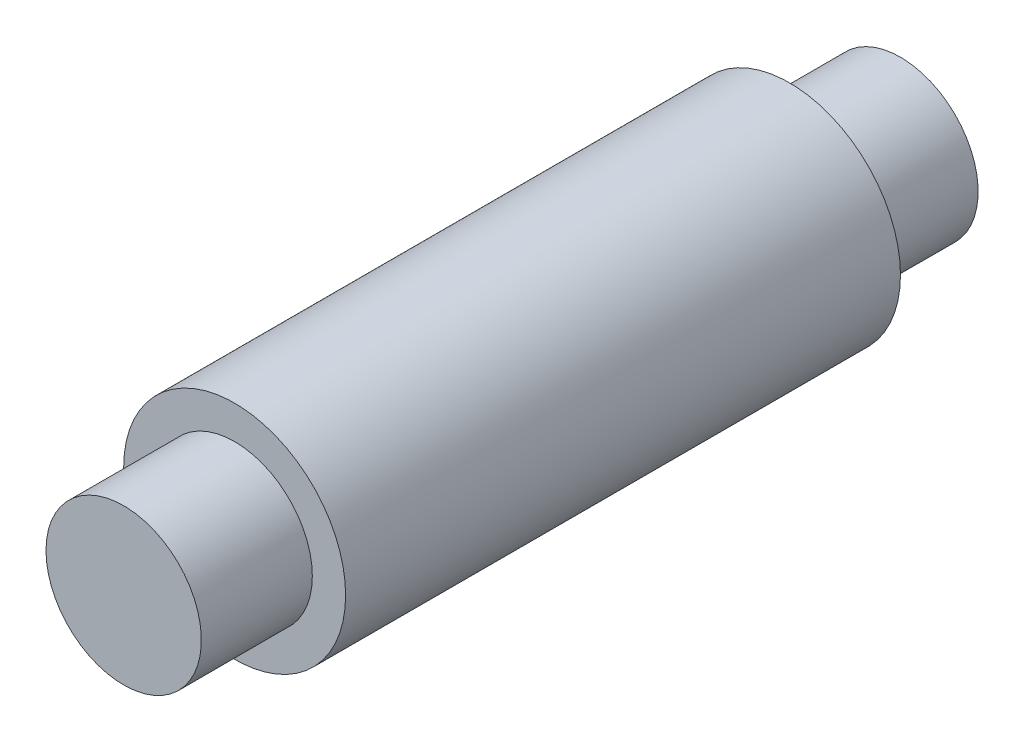
ISO-10303-21;
HEADER;
FILE_DESCRIPTION(('STEP AP214'),'2;1');
FILE_NAME('part.step','',(''),(''),'','','');
FILE_SCHEMA(('AUTOMOTIVE_DESIGN { 1 0 10303 214 1 1 1 1 }'));
ENDSEC;
DATA;
#1=APPLICATION_CONTEXT('core data for automotive mechanical design processes');
#2=APPLICATION_PROTOCOL_DEFINITION('international standard','automotive_design',2000,#1);
#3=PRODUCT_CONTEXT('',#1,'mechanical');
#4=PRODUCT('Part','Part','',(#3));
#5=PRODUCT_RELATED_PRODUCT_CATEGORY('part','',(#4));
#6=PRODUCT_DEFINITION_FORMATION('','',#4);
#7=PRODUCT_DEFINITION_CONTEXT('part definition',#1,'design');
#8=PRODUCT_DEFINITION('design','',#6,#7);
#9=PRODUCT_DEFINITION_SHAPE('','',#8);
#10=(LENGTH_UNIT() NAMED_UNIT(*) SI_UNIT(.MILLI.,.METRE.));
#11=(NAMED_UNIT(*) PLANE_ANGLE_UNIT() SI_UNIT($,.RADIAN.));
#12=(NAMED_UNIT(*) SI_UNIT($,.STERADIAN.) SOLID_ANGLE_UNIT());
#13=UNCERTAINTY_MEASURE_WITH_UNIT(LENGTH_MEASURE(1.E-05),#10,'distance_accuracy_value','');
#14=(GEOMETRIC_REPRESENTATION_CONTEXT(3) GLOBAL_UNCERTAINTY_ASSIGNED_CONTEXT((#13)) GLOBAL_UNIT_ASSIGNED_CONTEXT((#10,
#11,#12)) REPRESENTATION_CONTEXT('',''));
#15=CARTESIAN_POINT('',(0.,0.,0.));
#16=DIRECTION('',(0.,0.,1.));
#17=DIRECTION('',(1.,0.,0.));
#18=AXIS2_PLACEMENT_3D('',#15,#16,#17);
#19=CARTESIAN_POINT('',(0.,0.,10.));
#20=DIRECTION('',(0.,0.,1.));
#21=DIRECTION('',(1.,0.,0.));
#22=AXIS2_PLACEMENT_3D('',#19,#20,#21);
#23=PLANE('',#22);
#24=CARTESIAN_POINT('',(0.,0.,10.));
#25=DIRECTION('',(0.,0.,1.));
#26=DIRECTION('',(1.,0.,0.));
#27=AXIS2_PLACEMENT_3D('',#24,#25,#26);
#28=CIRCLE('',#27,1.4);
#29=CARTESIAN_POINT('',(1.4,0.,10.));
#30=VERTEX_POINT('',#29);
#31=EDGE_CURVE('E10',#30,#30,#28,.T.);
#32=ORIENTED_EDGE('',*,*,#31,.F.);
#33=EDGE_LOOP('',(#32));
#34=FACE_BOUND('',#33,.T.);
#35=CARTESIAN_POINT('',(0.,0.,10.));
#36=DIRECTION('',(0.,0.,1.));
#37=DIRECTION('',(1.,0.,0.));
#38=AXIS2_PLACEMENT_3D('',#35,#36,#37);
#39=CIRCLE('',#38,2.);
#40=CARTESIAN_POINT('',(2.,0.,10.));
#41=VERTEX_POINT('',#40);
#42=EDGE_CURVE('E54',#41,#41,#39,.T.);
#43=ORIENTED_EDGE('',*,*,#42,.T.);
#44=EDGE_LOOP('',(#43));
#45=FACE_BOUND('',#44,.T.);
#46=ADVANCED_FACE('F45',(#34,#45),#23,.T.);
#47=CARTESIAN_POINT('',(0.,0.,0.));
#48=DIRECTION('',(0.,0.,1.));
#49=DIRECTION('',(1.,0.,0.));
#50=AXIS2_PLACEMENT_3D('',#47,#48,#49);
#51=PLANE('',#50);
#52=CARTESIAN_POINT('',(0.,0.,0.));
#53=DIRECTION('',(0.,0.,1.));
#54=DIRECTION('',(1.,0.,0.));
#55=AXIS2_PLACEMENT_3D('',#52,#53,#54);
#56=CIRCLE('',#55,1.4);
#57=CARTESIAN_POINT('',(1.4,0.,0.));
#58=VERTEX_POINT('',#57);
#59=EDGE_CURVE('E49',#58,#58,#56,.T.);
#60=ORIENTED_EDGE('',*,*,#59,.T.);
#61=EDGE_LOOP('',(#60));
#62=FACE_BOUND('',#61,.T.);
#63=CARTESIAN_POINT('',(0.,0.,0.));
#64=DIRECTION('',(0.,0.,1.));
#65=DIRECTION('',(1.,0.,0.));
#66=AXIS2_PLACEMENT_3D('',#63,#64,#65);
#67=CIRCLE('',#66,2.);
#68=CARTESIAN_POINT('',(2.,0.,0.));
#69=VERTEX_POINT('',#68);
#70=EDGE_CURVE('E60',#69,#69,#67,.T.);
#71=ORIENTED_EDGE('',*,*,#70,.F.);
#72=EDGE_LOOP('',(#71));
#73=FACE_BOUND('',#72,.T.);
#74=ADVANCED_FACE('F98',(#62,#73),#51,.F.);
#75=CARTESIAN_POINT('',(0.,0.,10.));
#76=DIRECTION('',(0.,0.,-1.));
#77=DIRECTION('',(-1.,0.,0.));
#78=AXIS2_PLACEMENT_3D('',#75,#76,#77);
#79=CYLINDRICAL_SURFACE('',#78,2.);
#80=ORIENTED_EDGE('',*,*,#42,.F.);
#81=EDGE_LOOP('',(#80));
#82=FACE_BOUND('',#81,.T.);
#83=ORIENTED_EDGE('',*,*,#70,.T.);
#84=EDGE_LOOP('',(#83));
#85=FACE_BOUND('',#84,.T.);
#86=ADVANCED_FACE('F47',(#82,#85),#79,.T.);
#87=CARTESIAN_POINT('',(0.,0.,-2.));
#88=DIRECTION('',(0.,0.,-1.));
#89=DIRECTION('',(-1.,0.,0.));
#90=AXIS2_PLACEMENT_3D('',#87,#88,#89);
#91=PLANE('',#90);
#92=CARTESIAN_POINT('',(0.,0.,-2.));
#93=DIRECTION('',(0.,0.,-1.));
#94=DIRECTION('',(-1.,0.,0.));
#95=AXIS2_PLACEMENT_3D('',#92,#93,#94);
#96=CIRCLE('',#95,1.4);
#97=CARTESIAN_POINT('',(-1.4,0.,-2.));
#98=VERTEX_POINT('',#97);
#99=EDGE_CURVE('E75',#98,#98,#96,.T.);
#100=ORIENTED_EDGE('',*,*,#99,.T.);
#101=EDGE_LOOP('',(#100));
#102=FACE_BOUND('',#101,.T.);
#103=ADVANCED_FACE('F82',(#102),#91,.T.);
#104=CARTESIAN_POINT('',(0.,0.,12.));
#105=DIRECTION('',(0.,0.,-1.));
#106=DIRECTION('',(-1.,0.,0.));
#107=AXIS2_PLACEMENT_3D('',#104,#105,#106);
#108=CYLINDRICAL_SURFACE('',#107,1.4);
#109=ORIENTED_EDGE('',*,*,#99,.F.);
#110=EDGE_LOOP('',(#109));
#111=FACE_BOUND('',#110,.T.);
#112=ORIENTED_EDGE('',*,*,#59,.F.);
#113=EDGE_LOOP('',(#112));
#114=FACE_BOUND('',#113,.T.);
#115=ADVANCED_FACE('F84',(#111,#114),#108,.T.);
#116=ORIENTED_EDGE('',*,*,#31,.T.);
#117=EDGE_LOOP('',(#116));
#118=FACE_BOUND('',#117,.T.);
#119=CARTESIAN_POINT('',(0.,0.,12.));
#120=DIRECTION('',(0.,0.,-1.));
#121=DIRECTION('',(-1.,0.,0.));
#122=AXIS2_PLACEMENT_3D('',#119,#120,#121);
#123=CIRCLE('',#122,1.4);
#124=CARTESIAN_POINT('',(-1.4,0.,12.));
#125=VERTEX_POINT('',#124);
#126=EDGE_CURVE('E63',#125,#125,#123,.T.);
#127=ORIENTED_EDGE('',*,*,#126,.T.);
#128=EDGE_LOOP('',(#127));
#129=FACE_BOUND('',#128,.T.);
#130=ADVANCED_FACE('F87',(#118,#129),#108,.T.);
#131=CARTESIAN_POINT('',(0.,0.,12.));
#132=DIRECTION('',(0.,0.,-1.));
#133=DIRECTION('',(-1.,0.,0.));
#134=AXIS2_PLACEMENT_3D('',#131,#132,#133);
#135=PLANE('',#134);
#136=ORIENTED_EDGE('',*,*,#126,.F.);
#137=EDGE_LOOP('',(#136));
#138=FACE_BOUND('',#137,.T.);
#139=ADVANCED_FACE('F93',(#138),#135,.F.);
#140=CLOSED_SHELL('',(#46,#74,#86,#103,#115,#130,#139));
#141=MANIFOLD_SOLID_BREP('B2',#140);
#142=ADVANCED_BREP_SHAPE_REPRESENTATION('',(#18,#141),#14);
#143=SHAPE_DEFINITION_REPRESENTATION(#9,#142);
ENDSEC;
END-ISO-10303-21;
